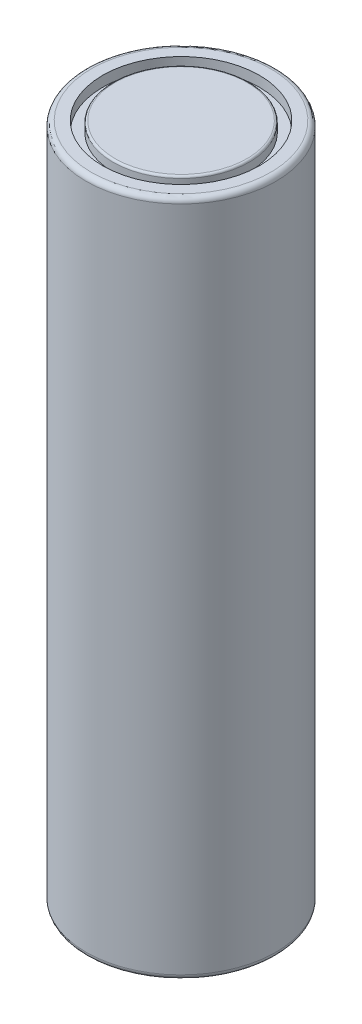
ISO-10303-21;
HEADER;
FILE_DESCRIPTION(('STEP AP214'),'2;1');
FILE_NAME('part.step','',(''),(''),'','','');
FILE_SCHEMA(('AUTOMOTIVE_DESIGN { 1 0 10303 214 1 1 1 1 }'));
ENDSEC;
DATA;
#1=APPLICATION_CONTEXT('core data for automotive mechanical design processes');
#2=APPLICATION_PROTOCOL_DEFINITION('international standard','automotive_design',2000,#1);
#3=PRODUCT_CONTEXT('',#1,'mechanical');
#4=PRODUCT('Part','Part','',(#3));
#5=PRODUCT_RELATED_PRODUCT_CATEGORY('part','',(#4));
#6=PRODUCT_DEFINITION_FORMATION('','',#4);
#7=PRODUCT_DEFINITION_CONTEXT('part definition',#1,'design');
#8=PRODUCT_DEFINITION('design','',#6,#7);
#9=PRODUCT_DEFINITION_SHAPE('','',#8);
#10=(LENGTH_UNIT() NAMED_UNIT(*) SI_UNIT(.MILLI.,.METRE.));
#11=(NAMED_UNIT(*) PLANE_ANGLE_UNIT() SI_UNIT($,.RADIAN.));
#12=(NAMED_UNIT(*) SI_UNIT($,.STERADIAN.) SOLID_ANGLE_UNIT());
#13=UNCERTAINTY_MEASURE_WITH_UNIT(LENGTH_MEASURE(1.E-05),#10,'distance_accuracy_value','');
#14=(GEOMETRIC_REPRESENTATION_CONTEXT(3) GLOBAL_UNCERTAINTY_ASSIGNED_CONTEXT((#13)) GLOBAL_UNIT_ASSIGNED_CONTEXT((#10,
#11,#12)) REPRESENTATION_CONTEXT('',''));
#15=CARTESIAN_POINT('',(0.,0.,0.));
#16=DIRECTION('',(0.,0.,1.));
#17=DIRECTION('',(1.,0.,0.));
#18=AXIS2_PLACEMENT_3D('',#15,#16,#17);
#19=CARTESIAN_POINT('',(0.,65.,0.));
#20=DIRECTION('',(0.,-1.,0.));
#21=DIRECTION('',(0.,0.,-1.));
#22=AXIS2_PLACEMENT_3D('',#19,#20,#21);
#23=CYLINDRICAL_SURFACE('',#22,9.1);
#24=CARTESIAN_POINT('',(0.,0.5,0.));
#25=DIRECTION('',(0.,1.,0.));
#26=DIRECTION('',(0.,0.,1.));
#27=AXIS2_PLACEMENT_3D('',#24,#25,#26);
#28=CIRCLE('',#27,9.1);
#29=CARTESIAN_POINT('',(0.,0.5,9.1));
#30=VERTEX_POINT('',#29);
#31=EDGE_CURVE('E67',#30,#30,#28,.T.);
#32=ORIENTED_EDGE('',*,*,#31,.T.);
#33=EDGE_LOOP('',(#32));
#34=FACE_BOUND('',#33,.T.);
#35=CARTESIAN_POINT('',(0.,64.5,0.));
#36=DIRECTION('',(0.,1.,0.));
#37=DIRECTION('',(0.,0.,1.));
#38=AXIS2_PLACEMENT_3D('',#35,#36,#37);
#39=CIRCLE('',#38,9.1);
#40=CARTESIAN_POINT('',(0.,64.5,9.1));
#41=VERTEX_POINT('',#40);
#42=EDGE_CURVE('E70',#41,#41,#39,.F.);
#43=ORIENTED_EDGE('',*,*,#42,.T.);
#44=EDGE_LOOP('',(#43));
#45=FACE_BOUND('',#44,.T.);
#46=ADVANCED_FACE('F41',(#34,#45),#23,.T.);
#47=CARTESIAN_POINT('',(0.,65.,0.));
#48=DIRECTION('',(0.,1.,0.));
#49=DIRECTION('',(0.,0.,1.));
#50=AXIS2_PLACEMENT_3D('',#47,#48,#49);
#51=PLANE('',#50);
#52=CARTESIAN_POINT('',(0.,65.,0.));
#53=DIRECTION('',(0.,1.,0.));
#54=DIRECTION('',(0.,0.,1.));
#55=AXIS2_PLACEMENT_3D('',#52,#53,#54);
#56=CIRCLE('',#55,8.6);
#57=CARTESIAN_POINT('',(0.,65.,8.6));
#58=VERTEX_POINT('',#57);
#59=EDGE_CURVE('E61',#58,#58,#56,.T.);
#60=ORIENTED_EDGE('',*,*,#59,.T.);
#61=EDGE_LOOP('',(#60));
#62=FACE_BOUND('',#61,.T.);
#63=CARTESIAN_POINT('',(0.,65.,0.));
#64=DIRECTION('',(0.,1.,0.));
#65=DIRECTION('',(0.,0.,1.));
#66=AXIS2_PLACEMENT_3D('',#63,#64,#65);
#67=CIRCLE('',#66,7.51581654783285);
#68=CARTESIAN_POINT('',(0.,65.,7.51581654783285));
#69=VERTEX_POINT('',#68);
#70=EDGE_CURVE('E74',#69,#69,#67,.T.);
#71=ORIENTED_EDGE('',*,*,#70,.F.);
#72=EDGE_LOOP('',(#71));
#73=FACE_BOUND('',#72,.T.);
#74=ADVANCED_FACE('F111',(#62,#73),#51,.T.);
#75=CARTESIAN_POINT('',(0.,0.,0.));
#76=DIRECTION('',(0.,1.,0.));
#77=DIRECTION('',(0.,0.,1.));
#78=AXIS2_PLACEMENT_3D('',#75,#76,#77);
#79=PLANE('',#78);
#80=CARTESIAN_POINT('',(0.,0.,0.));
#81=DIRECTION('',(0.,-1.,0.));
#82=DIRECTION('',(0.,0.,-1.));
#83=AXIS2_PLACEMENT_3D('',#80,#81,#82);
#84=CIRCLE('',#83,7.51581654783285);
#85=CARTESIAN_POINT('',(0.,0.,-7.51581654783285));
#86=VERTEX_POINT('',#85);
#87=EDGE_CURVE('E83',#86,#86,#84,.T.);
#88=ORIENTED_EDGE('',*,*,#87,.F.);
#89=EDGE_LOOP('',(#88));
#90=FACE_BOUND('',#89,.T.);
#91=CARTESIAN_POINT('',(0.,0.,0.));
#92=DIRECTION('',(0.,1.,0.));
#93=DIRECTION('',(0.,0.,1.));
#94=AXIS2_PLACEMENT_3D('',#91,#92,#93);
#95=CIRCLE('',#94,8.6);
#96=CARTESIAN_POINT('',(0.,0.,8.6));
#97=VERTEX_POINT('',#96);
#98=EDGE_CURVE('E64',#97,#97,#95,.F.);
#99=ORIENTED_EDGE('',*,*,#98,.T.);
#100=EDGE_LOOP('',(#99));
#101=FACE_BOUND('',#100,.T.);
#102=ADVANCED_FACE('F107',(#90,#101),#79,.F.);
#103=CARTESIAN_POINT('',(0.,64.,0.));
#104=DIRECTION('',(0.,1.,0.));
#105=DIRECTION('',(0.,0.,1.));
#106=AXIS2_PLACEMENT_3D('',#103,#104,#105);
#107=CYLINDRICAL_SURFACE('',#106,7.51581654783285);
#108=CARTESIAN_POINT('',(0.,64.,0.));
#109=DIRECTION('',(0.,1.,0.));
#110=DIRECTION('',(0.,0.,1.));
#111=AXIS2_PLACEMENT_3D('',#108,#109,#110);
#112=CIRCLE('',#111,7.51581654783285);
#113=CARTESIAN_POINT('',(0.,64.,7.51581654783285));
#114=VERTEX_POINT('',#113);
#115=EDGE_CURVE('E73',#114,#114,#112,.T.);
#116=ORIENTED_EDGE('',*,*,#115,.F.);
#117=EDGE_LOOP('',(#116));
#118=FACE_BOUND('',#117,.T.);
#119=ORIENTED_EDGE('',*,*,#70,.T.);
#120=EDGE_LOOP('',(#119));
#121=FACE_BOUND('',#120,.T.);
#122=ADVANCED_FACE('F110',(#118,#121),#107,.F.);
#123=CARTESIAN_POINT('',(0.,64.,0.));
#124=DIRECTION('',(0.,1.,0.));
#125=DIRECTION('',(0.,0.,1.));
#126=AXIS2_PLACEMENT_3D('',#123,#124,#125);
#127=PLANE('',#126);
#128=CARTESIAN_POINT('',(0.,64.,0.));
#129=DIRECTION('',(0.,1.,0.));
#130=DIRECTION('',(0.,0.,1.));
#131=AXIS2_PLACEMENT_3D('',#128,#129,#130);
#132=CIRCLE('',#131,6.52806202223023);
#133=CARTESIAN_POINT('',(0.,64.,6.52806202223023));
#134=VERTEX_POINT('',#133);
#135=EDGE_CURVE('E77',#134,#134,#132,.T.);
#136=ORIENTED_EDGE('',*,*,#135,.F.);
#137=EDGE_LOOP('',(#136));
#138=FACE_BOUND('',#137,.T.);
#139=ORIENTED_EDGE('',*,*,#115,.T.);
#140=EDGE_LOOP('',(#139));
#141=FACE_BOUND('',#140,.T.);
#142=ADVANCED_FACE('F139',(#138,#141),#127,.T.);
#143=CARTESIAN_POINT('',(0.,64.,0.));
#144=DIRECTION('',(0.,1.,0.));
#145=DIRECTION('',(0.,0.,1.));
#146=AXIS2_PLACEMENT_3D('',#143,#144,#145);
#147=CYLINDRICAL_SURFACE('',#146,6.52806202223023);
#148=CARTESIAN_POINT('',(0.,64.8,0.));
#149=DIRECTION('',(0.,1.,0.));
#150=DIRECTION('',(0.,0.,1.));
#151=AXIS2_PLACEMENT_3D('',#148,#149,#150);
#152=CIRCLE('',#151,6.52806202223023);
#153=CARTESIAN_POINT('',(0.,64.8,6.52806202223023));
#154=VERTEX_POINT('',#153);
#155=EDGE_CURVE('E10',#154,#154,#152,.F.);
#156=ORIENTED_EDGE('',*,*,#155,.T.);
#157=EDGE_LOOP('',(#156));
#158=FACE_BOUND('',#157,.T.);
#159=ORIENTED_EDGE('',*,*,#135,.T.);
#160=EDGE_LOOP('',(#159));
#161=FACE_BOUND('',#160,.T.);
#162=ADVANCED_FACE('F145',(#158,#161),#147,.T.);
#163=CARTESIAN_POINT('',(0.,65.,0.));
#164=DIRECTION('',(0.,1.,0.));
#165=DIRECTION('',(0.,0.,1.));
#166=AXIS2_PLACEMENT_3D('',#163,#164,#165);
#167=CIRCLE('',#166,6.32806202223023);
#168=CARTESIAN_POINT('',(0.,65.,6.32806202223023));
#169=VERTEX_POINT('',#168);
#170=EDGE_CURVE('E48',#169,#169,#167,.T.);
#171=ORIENTED_EDGE('',*,*,#170,.T.);
#172=EDGE_LOOP('',(#171));
#173=FACE_BOUND('',#172,.T.);
#174=ADVANCED_FACE('F119',(#173),#51,.T.);
#175=CARTESIAN_POINT('',(0.,0.5,0.));
#176=DIRECTION('',(0.,1.,0.));
#177=DIRECTION('',(0.,0.,1.));
#178=AXIS2_PLACEMENT_3D('',#175,#176,#177);
#179=TOROIDAL_SURFACE('',#178,8.6,0.5);
#180=ORIENTED_EDGE('',*,*,#98,.F.);
#181=EDGE_LOOP('',(#180));
#182=FACE_BOUND('',#181,.T.);
#183=ORIENTED_EDGE('',*,*,#31,.F.);
#184=EDGE_LOOP('',(#183));
#185=FACE_BOUND('',#184,.T.);
#186=ADVANCED_FACE('F116',(#182,#185),#179,.T.);
#187=CARTESIAN_POINT('',(0.,64.5,0.));
#188=DIRECTION('',(0.,1.,0.));
#189=DIRECTION('',(0.,0.,1.));
#190=AXIS2_PLACEMENT_3D('',#187,#188,#189);
#191=TOROIDAL_SURFACE('',#190,8.6,0.5);
#192=ORIENTED_EDGE('',*,*,#42,.F.);
#193=EDGE_LOOP('',(#192));
#194=FACE_BOUND('',#193,.T.);
#195=ORIENTED_EDGE('',*,*,#59,.F.);
#196=EDGE_LOOP('',(#195));
#197=FACE_BOUND('',#196,.T.);
#198=ADVANCED_FACE('F103',(#194,#197),#191,.T.);
#199=CARTESIAN_POINT('',(0.,1.,0.));
#200=DIRECTION('',(0.,-1.,0.));
#201=DIRECTION('',(0.,0.,-1.));
#202=AXIS2_PLACEMENT_3D('',#199,#200,#201);
#203=CYLINDRICAL_SURFACE('',#202,7.51581654783285);
#204=CARTESIAN_POINT('',(0.,1.,0.));
#205=DIRECTION('',(0.,-1.,0.));
#206=DIRECTION('',(0.,0.,-1.));
#207=AXIS2_PLACEMENT_3D('',#204,#205,#206);
#208=CIRCLE('',#207,7.51581654783285);
#209=CARTESIAN_POINT('',(0.,1.,-7.51581654783285));
#210=VERTEX_POINT('',#209);
#211=EDGE_CURVE('E82',#210,#210,#208,.T.);
#212=ORIENTED_EDGE('',*,*,#211,.F.);
#213=EDGE_LOOP('',(#212));
#214=FACE_BOUND('',#213,.T.);
#215=ORIENTED_EDGE('',*,*,#87,.T.);
#216=EDGE_LOOP('',(#215));
#217=FACE_BOUND('',#216,.T.);
#218=ADVANCED_FACE('F97',(#214,#217),#203,.F.);
#219=CARTESIAN_POINT('',(0.,1.,0.));
#220=DIRECTION('',(0.,-1.,0.));
#221=DIRECTION('',(0.,0.,-1.));
#222=AXIS2_PLACEMENT_3D('',#219,#220,#221);
#223=PLANE('',#222);
#224=CARTESIAN_POINT('',(0.,1.,0.));
#225=DIRECTION('',(0.,-1.,0.));
#226=DIRECTION('',(0.,0.,-1.));
#227=AXIS2_PLACEMENT_3D('',#224,#225,#226);
#228=CIRCLE('',#227,6.52806202223023);
#229=CARTESIAN_POINT('',(0.,1.,-6.52806202223023));
#230=VERTEX_POINT('',#229);
#231=EDGE_CURVE('E86',#230,#230,#228,.T.);
#232=ORIENTED_EDGE('',*,*,#231,.F.);
#233=EDGE_LOOP('',(#232));
#234=FACE_BOUND('',#233,.T.);
#235=ORIENTED_EDGE('',*,*,#211,.T.);
#236=EDGE_LOOP('',(#235));
#237=FACE_BOUND('',#236,.T.);
#238=ADVANCED_FACE('F94',(#234,#237),#223,.T.);
#239=CARTESIAN_POINT('',(0.,1.,0.));
#240=DIRECTION('',(0.,-1.,0.));
#241=DIRECTION('',(0.,0.,-1.));
#242=AXIS2_PLACEMENT_3D('',#239,#240,#241);
#243=CYLINDRICAL_SURFACE('',#242,6.52806202223023);
#244=CARTESIAN_POINT('',(0.,0.2,0.));
#245=DIRECTION('',(0.,1.,0.));
#246=DIRECTION('',(0.,0.,1.));
#247=AXIS2_PLACEMENT_3D('',#244,#245,#246);
#248=CIRCLE('',#247,6.52806202223023);
#249=CARTESIAN_POINT('',(0.,0.2,6.52806202223023));
#250=VERTEX_POINT('',#249);
#251=EDGE_CURVE('E52',#250,#250,#248,.T.);
#252=ORIENTED_EDGE('',*,*,#251,.T.);
#253=EDGE_LOOP('',(#252));
#254=FACE_BOUND('',#253,.T.);
#255=ORIENTED_EDGE('',*,*,#231,.T.);
#256=EDGE_LOOP('',(#255));
#257=FACE_BOUND('',#256,.T.);
#258=ADVANCED_FACE('F92',(#254,#257),#243,.T.);
#259=CARTESIAN_POINT('',(0.,0.,0.));
#260=DIRECTION('',(0.,1.,0.));
#261=DIRECTION('',(0.,0.,1.));
#262=AXIS2_PLACEMENT_3D('',#259,#260,#261);
#263=CIRCLE('',#262,6.32806202223023);
#264=CARTESIAN_POINT('',(0.,0.,6.32806202223023));
#265=VERTEX_POINT('',#264);
#266=EDGE_CURVE('E56',#265,#265,#263,.F.);
#267=ORIENTED_EDGE('',*,*,#266,.T.);
#268=EDGE_LOOP('',(#267));
#269=FACE_BOUND('',#268,.T.);
#270=ADVANCED_FACE('F113',(#269),#79,.F.);
#271=CARTESIAN_POINT('',(0.,0.2,0.));
#272=DIRECTION('',(0.,1.,0.));
#273=DIRECTION('',(0.,0.,1.));
#274=AXIS2_PLACEMENT_3D('',#271,#272,#273);
#275=TOROIDAL_SURFACE('',#274,6.32806202223023,0.2);
#276=ORIENTED_EDGE('',*,*,#251,.F.);
#277=EDGE_LOOP('',(#276));
#278=FACE_BOUND('',#277,.T.);
#279=ORIENTED_EDGE('',*,*,#266,.F.);
#280=EDGE_LOOP('',(#279));
#281=FACE_BOUND('',#280,.T.);
#282=ADVANCED_FACE('F150',(#278,#281),#275,.T.);
#283=CARTESIAN_POINT('',(0.,64.8,0.));
#284=DIRECTION('',(0.,1.,0.));
#285=DIRECTION('',(0.,0.,1.));
#286=AXIS2_PLACEMENT_3D('',#283,#284,#285);
#287=TOROIDAL_SURFACE('',#286,6.32806202223023,0.2);
#288=ORIENTED_EDGE('',*,*,#155,.F.);
#289=EDGE_LOOP('',(#288));
#290=FACE_BOUND('',#289,.T.);
#291=ORIENTED_EDGE('',*,*,#170,.F.);
#292=EDGE_LOOP('',(#291));
#293=FACE_BOUND('',#292,.T.);
#294=ADVANCED_FACE('F43',(#290,#293),#287,.T.);
#295=CLOSED_SHELL('',(#46,#74,#102,#122,#142,#162,#174,#186,#198,#218,#238,#258,#270,#282,#294));
#296=MANIFOLD_SOLID_BREP('B2',#295);
#297=ADVANCED_BREP_SHAPE_REPRESENTATION('',(#18,#296),#14);
#298=SHAPE_DEFINITION_REPRESENTATION(#9,#297);
ENDSEC;
END-ISO-10303-21;
